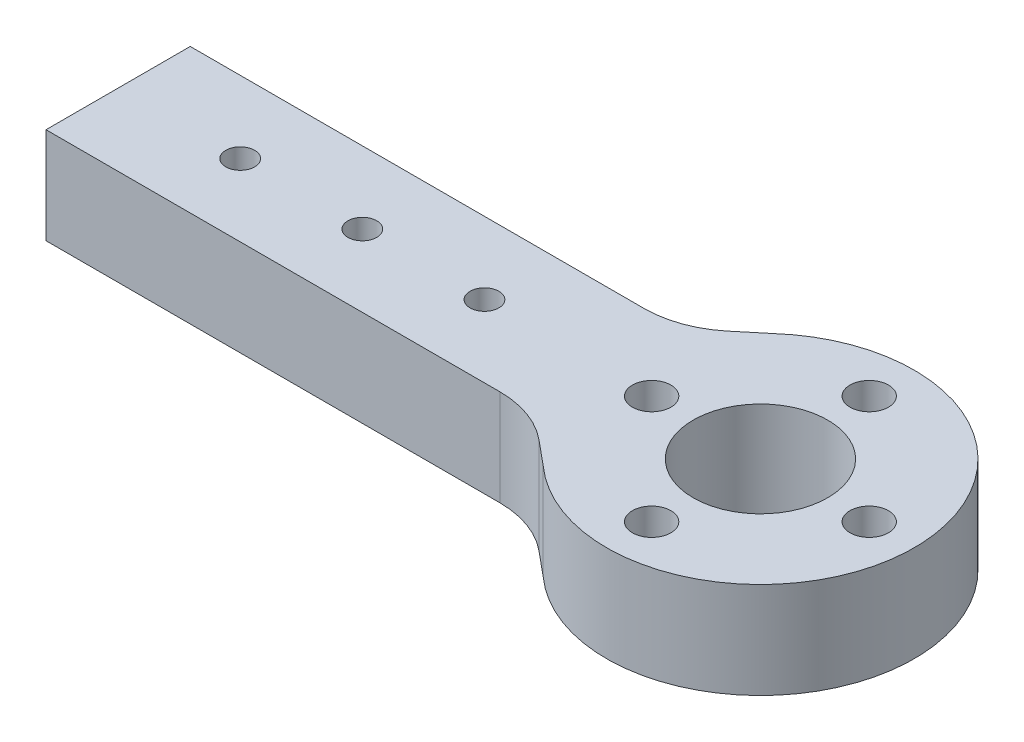
ISO-10303-21;
HEADER;
FILE_DESCRIPTION(('STEP AP214'),'2;1');
FILE_NAME('part.step','',(''),(''),'','','');
FILE_SCHEMA(('AUTOMOTIVE_DESIGN { 1 0 10303 214 1 1 1 1 }'));
ENDSEC;
DATA;
#1=APPLICATION_CONTEXT('core data for automotive mechanical design processes');
#2=APPLICATION_PROTOCOL_DEFINITION('international standard','automotive_design',2000,#1);
#3=PRODUCT_CONTEXT('',#1,'mechanical');
#4=PRODUCT('Part','Part','',(#3));
#5=PRODUCT_RELATED_PRODUCT_CATEGORY('part','',(#4));
#6=PRODUCT_DEFINITION_FORMATION('','',#4);
#7=PRODUCT_DEFINITION_CONTEXT('part definition',#1,'design');
#8=PRODUCT_DEFINITION('design','',#6,#7);
#9=PRODUCT_DEFINITION_SHAPE('','',#8);
#10=(LENGTH_UNIT() NAMED_UNIT(*) SI_UNIT(.MILLI.,.METRE.));
#11=(NAMED_UNIT(*) PLANE_ANGLE_UNIT() SI_UNIT($,.RADIAN.));
#12=(NAMED_UNIT(*) SI_UNIT($,.STERADIAN.) SOLID_ANGLE_UNIT());
#13=UNCERTAINTY_MEASURE_WITH_UNIT(LENGTH_MEASURE(1.E-05),#10,'distance_accuracy_value','');
#14=(GEOMETRIC_REPRESENTATION_CONTEXT(3) GLOBAL_UNCERTAINTY_ASSIGNED_CONTEXT((#13)) GLOBAL_UNIT_ASSIGNED_CONTEXT((#10,
#11,#12)) REPRESENTATION_CONTEXT('',''));
#15=CARTESIAN_POINT('',(0.,0.,0.));
#16=DIRECTION('',(0.,0.,1.));
#17=DIRECTION('',(1.,0.,0.));
#18=AXIS2_PLACEMENT_3D('',#15,#16,#17);
#19=CARTESIAN_POINT('',(20.7132446022363,10.,-24.9638603553524));
#20=DIRECTION('',(0.638546032386932,0.,-0.769583630623019));
#21=DIRECTION('',(-0.769583630623019,0.,-0.638546032386932));
#22=AXIS2_PLACEMENT_3D('',#19,#20,#21);
#23=PLANE('',#22);
#24=DIRECTION('',(0.769583630623019,0.,0.638546032386932));
#25=VECTOR('',#24,1.);
#26=CARTESIAN_POINT('',(20.7132446022363,0.,-24.9638603553524));
#27=LINE('',#26,#25);
#28=CARTESIAN_POINT('',(53.5770067795623,0.,2.3041636937698));
#29=VERTEX_POINT('',#28);
#30=CARTESIAN_POINT('',(56.126078820761,0.,4.41920327284473));
#31=VERTEX_POINT('',#30);
#32=EDGE_CURVE('E159',#29,#31,#27,.T.);
#33=ORIENTED_EDGE('',*,*,#32,.T.);
#34=DIRECTION('',(0.,-1.,0.));
#35=VECTOR('',#34,1.);
#36=CARTESIAN_POINT('',(56.126078820761,10.,4.41920327284473));
#37=LINE('',#36,#35);
#38=CARTESIAN_POINT('',(56.126078820761,10.,4.41920327284473));
#39=VERTEX_POINT('',#38);
#40=EDGE_CURVE('E11',#39,#31,#37,.T.);
#41=ORIENTED_EDGE('',*,*,#40,.F.);
#42=DIRECTION('',(0.769583630623019,0.,0.638546032386932));
#43=VECTOR('',#42,1.);
#44=CARTESIAN_POINT('',(20.7132446022363,10.,-24.9638603553524));
#45=LINE('',#44,#43);
#46=CARTESIAN_POINT('',(53.5770067795623,10.,2.3041636937698));
#47=VERTEX_POINT('',#46);
#48=EDGE_CURVE('E219',#47,#39,#45,.T.);
#49=ORIENTED_EDGE('',*,*,#48,.F.);
#50=DIRECTION('',(0.,-1.,0.));
#51=VECTOR('',#50,1.);
#52=CARTESIAN_POINT('',(53.5770067795623,10.,2.3041636937698));
#53=LINE('',#52,#51);
#54=EDGE_CURVE('E52',#47,#29,#53,.T.);
#55=ORIENTED_EDGE('',*,*,#54,.T.);
#56=EDGE_LOOP('',(#33,#41,#49,#55));
#57=FACE_BOUND('',#56,.T.);
#58=ADVANCED_FACE('F35',(#57),#23,.F.);
#59=CARTESIAN_POINT('',(66.8,10.,-7.5));
#60=DIRECTION('',(0.,-1.,0.));
#61=DIRECTION('',(0.,0.,-1.));
#62=AXIS2_PLACEMENT_3D('',#59,#60,#61);
#63=CYLINDRICAL_SURFACE('',#62,16.);
#64=CARTESIAN_POINT('',(66.8,0.,-7.5));
#65=DIRECTION('',(0.,1.,0.));
#66=DIRECTION('',(0.,0.,1.));
#67=AXIS2_PLACEMENT_3D('',#64,#65,#66);
#68=CIRCLE('',#67,16.);
#69=CARTESIAN_POINT('',(56.126078820761,0.,-19.4192032728447));
#70=VERTEX_POINT('',#69);
#71=EDGE_CURVE('E161',#31,#70,#68,.T.);
#72=ORIENTED_EDGE('',*,*,#71,.T.);
#73=DIRECTION('',(0.,-1.,0.));
#74=VECTOR('',#73,1.);
#75=CARTESIAN_POINT('',(56.126078820761,10.,-19.4192032728447));
#76=LINE('',#75,#74);
#77=CARTESIAN_POINT('',(56.126078820761,10.,-19.4192032728447));
#78=VERTEX_POINT('',#77);
#79=EDGE_CURVE('E44',#78,#70,#76,.T.);
#80=ORIENTED_EDGE('',*,*,#79,.F.);
#81=CARTESIAN_POINT('',(66.8,10.,-7.5));
#82=DIRECTION('',(0.,1.,0.));
#83=DIRECTION('',(0.,0.,1.));
#84=AXIS2_PLACEMENT_3D('',#81,#82,#83);
#85=CIRCLE('',#84,16.);
#86=EDGE_CURVE('E91',#39,#78,#85,.T.);
#87=ORIENTED_EDGE('',*,*,#86,.F.);
#88=ORIENTED_EDGE('',*,*,#40,.T.);
#89=EDGE_LOOP('',(#72,#80,#87,#88));
#90=FACE_BOUND('',#89,.T.);
#91=ADVANCED_FACE('F207',(#90),#63,.T.);
#92=CARTESIAN_POINT('',(13.3420259933725,10.,16.0799758875088));
#93=DIRECTION('',(-0.638546032386932,0.,-0.769583630623019));
#94=DIRECTION('',(-0.769583630623019,0.,0.638546032386932));
#95=AXIS2_PLACEMENT_3D('',#92,#93,#94);
#96=PLANE('',#95);
#97=DIRECTION('',(0.769583630623019,0.,-0.638546032386932));
#98=VECTOR('',#97,1.);
#99=CARTESIAN_POINT('',(13.3420259933725,0.,16.0799758875088));
#100=LINE('',#99,#98);
#101=CARTESIAN_POINT('',(53.5770067795623,0.,-17.3041636937698));
#102=VERTEX_POINT('',#101);
#103=EDGE_CURVE('E164',#102,#70,#100,.T.);
#104=ORIENTED_EDGE('',*,*,#103,.F.);
#105=DIRECTION('',(0.,-1.,0.));
#106=VECTOR('',#105,1.);
#107=CARTESIAN_POINT('',(53.5770067795623,10.,-17.3041636937698));
#108=LINE('',#107,#106);
#109=CARTESIAN_POINT('',(53.5770067795623,10.,-17.3041636937698));
#110=VERTEX_POINT('',#109);
#111=EDGE_CURVE('E200',#110,#102,#108,.T.);
#112=ORIENTED_EDGE('',*,*,#111,.F.);
#113=DIRECTION('',(0.769583630623019,0.,-0.638546032386932));
#114=VECTOR('',#113,1.);
#115=CARTESIAN_POINT('',(13.3420259933725,10.,16.0799758875088));
#116=LINE('',#115,#114);
#117=EDGE_CURVE('E206',#110,#78,#116,.T.);
#118=ORIENTED_EDGE('',*,*,#117,.T.);
#119=ORIENTED_EDGE('',*,*,#79,.T.);
#120=EDGE_LOOP('',(#104,#112,#118,#119));
#121=FACE_BOUND('',#120,.T.);
#122=ADVANCED_FACE('F204',(#121),#96,.T.);
#123=CARTESIAN_POINT('',(47.191546455693,10.,-25.));
#124=DIRECTION('',(0.,-1.,0.));
#125=DIRECTION('',(0.,0.,-1.));
#126=AXIS2_PLACEMENT_3D('',#123,#124,#125);
#127=CYLINDRICAL_SURFACE('',#126,10.);
#128=CARTESIAN_POINT('',(47.191546455693,0.,-25.));
#129=DIRECTION('',(0.,1.,0.));
#130=DIRECTION('',(0.,0.,1.));
#131=AXIS2_PLACEMENT_3D('',#128,#129,#130);
#132=CIRCLE('',#131,10.);
#133=CARTESIAN_POINT('',(47.191546455693,0.,-15.));
#134=VERTEX_POINT('',#133);
#135=EDGE_CURVE('E167',#102,#134,#132,.F.);
#136=ORIENTED_EDGE('',*,*,#135,.T.);
#137=DIRECTION('',(0.,-1.,0.));
#138=VECTOR('',#137,1.);
#139=CARTESIAN_POINT('',(47.191546455693,10.,-15.));
#140=LINE('',#139,#138);
#141=CARTESIAN_POINT('',(47.191546455693,10.,-15.));
#142=VERTEX_POINT('',#141);
#143=EDGE_CURVE('E198',#142,#134,#140,.T.);
#144=ORIENTED_EDGE('',*,*,#143,.F.);
#145=CARTESIAN_POINT('',(47.191546455693,10.,-25.));
#146=DIRECTION('',(0.,1.,0.));
#147=DIRECTION('',(0.,0.,1.));
#148=AXIS2_PLACEMENT_3D('',#145,#146,#147);
#149=CIRCLE('',#148,10.);
#150=EDGE_CURVE('E130',#110,#142,#149,.F.);
#151=ORIENTED_EDGE('',*,*,#150,.F.);
#152=ORIENTED_EDGE('',*,*,#111,.T.);
#153=EDGE_LOOP('',(#136,#144,#151,#152));
#154=FACE_BOUND('',#153,.T.);
#155=ADVANCED_FACE('F216',(#154),#127,.F.);
#156=CARTESIAN_POINT('',(0.,10.,-15.));
#157=DIRECTION('',(0.,0.,-1.));
#158=DIRECTION('',(-1.,0.,0.));
#159=AXIS2_PLACEMENT_3D('',#156,#157,#158);
#160=PLANE('',#159);
#161=DIRECTION('',(1.,0.,0.));
#162=VECTOR('',#161,1.);
#163=CARTESIAN_POINT('',(0.,0.,-15.));
#164=LINE('',#163,#162);
#165=CARTESIAN_POINT('',(0.,0.,-15.));
#166=VERTEX_POINT('',#165);
#167=EDGE_CURVE('E170',#166,#134,#164,.T.);
#168=ORIENTED_EDGE('',*,*,#167,.F.);
#169=DIRECTION('',(0.,-1.,0.));
#170=VECTOR('',#169,1.);
#171=CARTESIAN_POINT('',(0.,10.,-15.));
#172=LINE('',#171,#170);
#173=CARTESIAN_POINT('',(0.,10.,-15.));
#174=VERTEX_POINT('',#173);
#175=EDGE_CURVE('E116',#174,#166,#172,.T.);
#176=ORIENTED_EDGE('',*,*,#175,.F.);
#177=DIRECTION('',(1.,0.,0.));
#178=VECTOR('',#177,1.);
#179=CARTESIAN_POINT('',(0.,10.,-15.));
#180=LINE('',#179,#178);
#181=EDGE_CURVE('E128',#174,#142,#180,.T.);
#182=ORIENTED_EDGE('',*,*,#181,.T.);
#183=ORIENTED_EDGE('',*,*,#143,.T.);
#184=EDGE_LOOP('',(#168,#176,#182,#183));
#185=FACE_BOUND('',#184,.T.);
#186=ADVANCED_FACE('F301',(#185),#160,.T.);
#187=CARTESIAN_POINT('',(0.,10.,0.));
#188=DIRECTION('',(-1.,0.,0.));
#189=DIRECTION('',(0.,0.,1.));
#190=AXIS2_PLACEMENT_3D('',#187,#188,#189);
#191=PLANE('',#190);
#192=DIRECTION('',(0.,0.,-1.));
#193=VECTOR('',#192,1.);
#194=CARTESIAN_POINT('',(0.,0.,0.));
#195=LINE('',#194,#193);
#196=CARTESIAN_POINT('',(0.,0.,0.));
#197=VERTEX_POINT('',#196);
#198=EDGE_CURVE('E113',#197,#166,#195,.T.);
#199=ORIENTED_EDGE('',*,*,#198,.F.);
#200=DIRECTION('',(0.,-1.,0.));
#201=VECTOR('',#200,1.);
#202=CARTESIAN_POINT('',(0.,10.,0.));
#203=LINE('',#202,#201);
#204=CARTESIAN_POINT('',(0.,10.,0.));
#205=VERTEX_POINT('',#204);
#206=EDGE_CURVE('E107',#205,#197,#203,.T.);
#207=ORIENTED_EDGE('',*,*,#206,.F.);
#208=DIRECTION('',(0.,0.,-1.));
#209=VECTOR('',#208,1.);
#210=CARTESIAN_POINT('',(0.,10.,0.));
#211=LINE('',#210,#209);
#212=EDGE_CURVE('E111',#205,#174,#211,.T.);
#213=ORIENTED_EDGE('',*,*,#212,.T.);
#214=ORIENTED_EDGE('',*,*,#175,.T.);
#215=EDGE_LOOP('',(#199,#207,#213,#214));
#216=FACE_BOUND('',#215,.T.);
#217=ADVANCED_FACE('F109',(#216),#191,.T.);
#218=CARTESIAN_POINT('',(0.,10.,0.));
#219=DIRECTION('',(0.,0.,-1.));
#220=DIRECTION('',(-1.,0.,0.));
#221=AXIS2_PLACEMENT_3D('',#218,#219,#220);
#222=PLANE('',#221);
#223=DIRECTION('',(1.,0.,0.));
#224=VECTOR('',#223,1.);
#225=CARTESIAN_POINT('',(0.,0.,0.));
#226=LINE('',#225,#224);
#227=CARTESIAN_POINT('',(47.191546455693,0.,0.));
#228=VERTEX_POINT('',#227);
#229=EDGE_CURVE('E174',#197,#228,#226,.T.);
#230=ORIENTED_EDGE('',*,*,#229,.T.);
#231=DIRECTION('',(0.,-1.,0.));
#232=VECTOR('',#231,1.);
#233=CARTESIAN_POINT('',(47.191546455693,10.,0.));
#234=LINE('',#233,#232);
#235=CARTESIAN_POINT('',(47.191546455693,10.,0.));
#236=VERTEX_POINT('',#235);
#237=EDGE_CURVE('E79',#236,#228,#234,.T.);
#238=ORIENTED_EDGE('',*,*,#237,.F.);
#239=DIRECTION('',(1.,0.,0.));
#240=VECTOR('',#239,1.);
#241=CARTESIAN_POINT('',(0.,10.,0.));
#242=LINE('',#241,#240);
#243=EDGE_CURVE('E118',#205,#236,#242,.T.);
#244=ORIENTED_EDGE('',*,*,#243,.F.);
#245=ORIENTED_EDGE('',*,*,#206,.T.);
#246=EDGE_LOOP('',(#230,#238,#244,#245));
#247=FACE_BOUND('',#246,.T.);
#248=ADVANCED_FACE('F119',(#247),#222,.F.);
#249=CARTESIAN_POINT('',(78.1137085,10.,-7.5));
#250=DIRECTION('',(0.,-1.,0.));
#251=DIRECTION('',(0.,0.,-1.));
#252=AXIS2_PLACEMENT_3D('',#249,#250,#251);
#253=CYLINDRICAL_SURFACE('',#252,2.);
#254=CARTESIAN_POINT('',(78.1137085,10.,-7.5));
#255=DIRECTION('',(0.,1.,0.));
#256=DIRECTION('',(0.,0.,1.));
#257=AXIS2_PLACEMENT_3D('',#254,#255,#256);
#258=CIRCLE('',#257,2.);
#259=CARTESIAN_POINT('',(78.1137085,10.,-5.5));
#260=VERTEX_POINT('',#259);
#261=EDGE_CURVE('E144',#260,#260,#258,.T.);
#262=ORIENTED_EDGE('',*,*,#261,.T.);
#263=EDGE_LOOP('',(#262));
#264=FACE_BOUND('',#263,.T.);
#265=CARTESIAN_POINT('',(78.1137085,0.,-7.5));
#266=DIRECTION('',(0.,1.,0.));
#267=DIRECTION('',(0.,0.,1.));
#268=AXIS2_PLACEMENT_3D('',#265,#266,#267);
#269=CIRCLE('',#268,2.);
#270=CARTESIAN_POINT('',(78.1137085,0.,-5.5));
#271=VERTEX_POINT('',#270);
#272=EDGE_CURVE('E188',#271,#271,#269,.T.);
#273=ORIENTED_EDGE('',*,*,#272,.F.);
#274=EDGE_LOOP('',(#273));
#275=FACE_BOUND('',#274,.T.);
#276=ADVANCED_FACE('F279',(#264,#275),#253,.F.);
#277=CARTESIAN_POINT('',(25.4,10.,-7.5));
#278=DIRECTION('',(0.,-1.,0.));
#279=DIRECTION('',(0.,0.,-1.));
#280=AXIS2_PLACEMENT_3D('',#277,#278,#279);
#281=CYLINDRICAL_SURFACE('',#280,1.5);
#282=CARTESIAN_POINT('',(25.4,10.,-7.5));
#283=DIRECTION('',(0.,1.,0.));
#284=DIRECTION('',(0.,0.,1.));
#285=AXIS2_PLACEMENT_3D('',#282,#283,#284);
#286=CIRCLE('',#285,1.5);
#287=CARTESIAN_POINT('',(25.4,10.,-6.));
#288=VERTEX_POINT('',#287);
#289=EDGE_CURVE('E141',#288,#288,#286,.T.);
#290=ORIENTED_EDGE('',*,*,#289,.T.);
#291=EDGE_LOOP('',(#290));
#292=FACE_BOUND('',#291,.T.);
#293=CARTESIAN_POINT('',(25.4,0.,-7.5));
#294=DIRECTION('',(0.,1.,0.));
#295=DIRECTION('',(0.,0.,1.));
#296=AXIS2_PLACEMENT_3D('',#293,#294,#295);
#297=CIRCLE('',#296,1.5);
#298=CARTESIAN_POINT('',(25.4,0.,-6.));
#299=VERTEX_POINT('',#298);
#300=EDGE_CURVE('E185',#299,#299,#297,.T.);
#301=ORIENTED_EDGE('',*,*,#300,.F.);
#302=EDGE_LOOP('',(#301));
#303=FACE_BOUND('',#302,.T.);
#304=ADVANCED_FACE('F282',(#292,#303),#281,.F.);
#305=CARTESIAN_POINT('',(38.1,10.,-7.5));
#306=DIRECTION('',(0.,-1.,0.));
#307=DIRECTION('',(0.,0.,-1.));
#308=AXIS2_PLACEMENT_3D('',#305,#306,#307);
#309=CYLINDRICAL_SURFACE('',#308,1.5);
#310=CARTESIAN_POINT('',(38.1,10.,-7.5));
#311=DIRECTION('',(0.,1.,0.));
#312=DIRECTION('',(0.,0.,1.));
#313=AXIS2_PLACEMENT_3D('',#310,#311,#312);
#314=CIRCLE('',#313,1.5);
#315=CARTESIAN_POINT('',(38.1,10.,-6.));
#316=VERTEX_POINT('',#315);
#317=EDGE_CURVE('E138',#316,#316,#314,.T.);
#318=ORIENTED_EDGE('',*,*,#317,.T.);
#319=EDGE_LOOP('',(#318));
#320=FACE_BOUND('',#319,.T.);
#321=CARTESIAN_POINT('',(38.1,0.,-7.5));
#322=DIRECTION('',(0.,1.,0.));
#323=DIRECTION('',(0.,0.,1.));
#324=AXIS2_PLACEMENT_3D('',#321,#322,#323);
#325=CIRCLE('',#324,1.5);
#326=CARTESIAN_POINT('',(38.1,0.,-6.));
#327=VERTEX_POINT('',#326);
#328=EDGE_CURVE('E182',#327,#327,#325,.T.);
#329=ORIENTED_EDGE('',*,*,#328,.F.);
#330=EDGE_LOOP('',(#329));
#331=FACE_BOUND('',#330,.T.);
#332=ADVANCED_FACE('F286',(#320,#331),#309,.F.);
#333=CARTESIAN_POINT('',(12.7,10.,-7.5));
#334=DIRECTION('',(0.,-1.,0.));
#335=DIRECTION('',(0.,0.,-1.));
#336=AXIS2_PLACEMENT_3D('',#333,#334,#335);
#337=CYLINDRICAL_SURFACE('',#336,1.5);
#338=CARTESIAN_POINT('',(12.7,10.,-7.5));
#339=DIRECTION('',(0.,1.,0.));
#340=DIRECTION('',(0.,0.,1.));
#341=AXIS2_PLACEMENT_3D('',#338,#339,#340);
#342=CIRCLE('',#341,1.5);
#343=CARTESIAN_POINT('',(12.7,10.,-6.));
#344=VERTEX_POINT('',#343);
#345=EDGE_CURVE('E135',#344,#344,#342,.T.);
#346=ORIENTED_EDGE('',*,*,#345,.T.);
#347=EDGE_LOOP('',(#346));
#348=FACE_BOUND('',#347,.T.);
#349=CARTESIAN_POINT('',(12.7,0.,-7.5));
#350=DIRECTION('',(0.,1.,0.));
#351=DIRECTION('',(0.,0.,1.));
#352=AXIS2_PLACEMENT_3D('',#349,#350,#351);
#353=CIRCLE('',#352,1.5);
#354=CARTESIAN_POINT('',(12.7,0.,-6.));
#355=VERTEX_POINT('',#354);
#356=EDGE_CURVE('E179',#355,#355,#353,.T.);
#357=ORIENTED_EDGE('',*,*,#356,.F.);
#358=EDGE_LOOP('',(#357));
#359=FACE_BOUND('',#358,.T.);
#360=ADVANCED_FACE('F290',(#348,#359),#337,.F.);
#361=CARTESIAN_POINT('',(47.191546455693,10.,10.));
#362=DIRECTION('',(0.,-1.,0.));
#363=DIRECTION('',(0.,0.,-1.));
#364=AXIS2_PLACEMENT_3D('',#361,#362,#363);
#365=CYLINDRICAL_SURFACE('',#364,10.);
#366=CARTESIAN_POINT('',(47.191546455693,0.,10.));
#367=DIRECTION('',(0.,1.,0.));
#368=DIRECTION('',(0.,0.,1.));
#369=AXIS2_PLACEMENT_3D('',#366,#367,#368);
#370=CIRCLE('',#369,10.);
#371=EDGE_CURVE('E176',#29,#228,#370,.T.);
#372=ORIENTED_EDGE('',*,*,#371,.F.);
#373=ORIENTED_EDGE('',*,*,#54,.F.);
#374=CARTESIAN_POINT('',(47.191546455693,10.,10.));
#375=DIRECTION('',(0.,1.,0.));
#376=DIRECTION('',(0.,0.,1.));
#377=AXIS2_PLACEMENT_3D('',#374,#375,#376);
#378=CIRCLE('',#377,10.);
#379=EDGE_CURVE('E122',#47,#236,#378,.T.);
#380=ORIENTED_EDGE('',*,*,#379,.T.);
#381=ORIENTED_EDGE('',*,*,#237,.T.);
#382=EDGE_LOOP('',(#372,#373,#380,#381));
#383=FACE_BOUND('',#382,.T.);
#384=ADVANCED_FACE('F246',(#383),#365,.F.);
#385=CARTESIAN_POINT('',(66.8,10.,-18.8137085));
#386=DIRECTION('',(0.,-1.,0.));
#387=DIRECTION('',(0.,0.,-1.));
#388=AXIS2_PLACEMENT_3D('',#385,#386,#387);
#389=CYLINDRICAL_SURFACE('',#388,2.);
#390=CARTESIAN_POINT('',(66.8,10.,-18.8137085));
#391=DIRECTION('',(0.,1.,0.));
#392=DIRECTION('',(0.,0.,1.));
#393=AXIS2_PLACEMENT_3D('',#390,#391,#392);
#394=CIRCLE('',#393,2.);
#395=CARTESIAN_POINT('',(66.8,10.,-16.8137085));
#396=VERTEX_POINT('',#395);
#397=EDGE_CURVE('E223',#396,#396,#394,.T.);
#398=ORIENTED_EDGE('',*,*,#397,.T.);
#399=EDGE_LOOP('',(#398));
#400=FACE_BOUND('',#399,.T.);
#401=CARTESIAN_POINT('',(66.8,0.,-18.8137085));
#402=DIRECTION('',(0.,1.,0.));
#403=DIRECTION('',(0.,0.,1.));
#404=AXIS2_PLACEMENT_3D('',#401,#402,#403);
#405=CIRCLE('',#404,2.);
#406=CARTESIAN_POINT('',(66.8,0.,-16.8137085));
#407=VERTEX_POINT('',#406);
#408=EDGE_CURVE('E156',#407,#407,#405,.T.);
#409=ORIENTED_EDGE('',*,*,#408,.F.);
#410=EDGE_LOOP('',(#409));
#411=FACE_BOUND('',#410,.T.);
#412=ADVANCED_FACE('F242',(#400,#411),#389,.F.);
#413=CARTESIAN_POINT('',(55.4862915,10.,-7.5));
#414=DIRECTION('',(0.,-1.,0.));
#415=DIRECTION('',(0.,0.,-1.));
#416=AXIS2_PLACEMENT_3D('',#413,#414,#415);
#417=CYLINDRICAL_SURFACE('',#416,2.);
#418=CARTESIAN_POINT('',(55.4862915,10.,-7.5));
#419=DIRECTION('',(0.,1.,0.));
#420=DIRECTION('',(0.,0.,1.));
#421=AXIS2_PLACEMENT_3D('',#418,#419,#420);
#422=CIRCLE('',#421,2.);
#423=CARTESIAN_POINT('',(55.4862915,10.,-5.5));
#424=VERTEX_POINT('',#423);
#425=EDGE_CURVE('E226',#424,#424,#422,.T.);
#426=ORIENTED_EDGE('',*,*,#425,.T.);
#427=EDGE_LOOP('',(#426));
#428=FACE_BOUND('',#427,.T.);
#429=CARTESIAN_POINT('',(55.4862915,0.,-7.5));
#430=DIRECTION('',(0.,1.,0.));
#431=DIRECTION('',(0.,0.,1.));
#432=AXIS2_PLACEMENT_3D('',#429,#430,#431);
#433=CIRCLE('',#432,2.);
#434=CARTESIAN_POINT('',(55.4862915,0.,-5.5));
#435=VERTEX_POINT('',#434);
#436=EDGE_CURVE('E153',#435,#435,#433,.T.);
#437=ORIENTED_EDGE('',*,*,#436,.F.);
#438=EDGE_LOOP('',(#437));
#439=FACE_BOUND('',#438,.T.);
#440=ADVANCED_FACE('F245',(#428,#439),#417,.F.);
#441=CARTESIAN_POINT('',(66.8,10.,3.81370850000001));
#442=DIRECTION('',(0.,-1.,0.));
#443=DIRECTION('',(0.,0.,-1.));
#444=AXIS2_PLACEMENT_3D('',#441,#442,#443);
#445=CYLINDRICAL_SURFACE('',#444,2.);
#446=CARTESIAN_POINT('',(66.8,10.,3.81370850000001));
#447=DIRECTION('',(0.,1.,0.));
#448=DIRECTION('',(0.,0.,1.));
#449=AXIS2_PLACEMENT_3D('',#446,#447,#448);
#450=CIRCLE('',#449,2.);
#451=CARTESIAN_POINT('',(66.8,10.,5.8137085));
#452=VERTEX_POINT('',#451);
#453=EDGE_CURVE('E194',#452,#452,#450,.T.);
#454=ORIENTED_EDGE('',*,*,#453,.T.);
#455=EDGE_LOOP('',(#454));
#456=FACE_BOUND('',#455,.T.);
#457=CARTESIAN_POINT('',(66.8,0.,3.81370850000001));
#458=DIRECTION('',(0.,1.,0.));
#459=DIRECTION('',(0.,0.,1.));
#460=AXIS2_PLACEMENT_3D('',#457,#458,#459);
#461=CIRCLE('',#460,2.);
#462=CARTESIAN_POINT('',(66.8,0.,5.8137085));
#463=VERTEX_POINT('',#462);
#464=EDGE_CURVE('E150',#463,#463,#461,.T.);
#465=ORIENTED_EDGE('',*,*,#464,.F.);
#466=EDGE_LOOP('',(#465));
#467=FACE_BOUND('',#466,.T.);
#468=ADVANCED_FACE('F37',(#456,#467),#445,.F.);
#469=CARTESIAN_POINT('',(66.8,10.,-7.5));
#470=DIRECTION('',(0.,-1.,0.));
#471=DIRECTION('',(0.,0.,-1.));
#472=AXIS2_PLACEMENT_3D('',#469,#470,#471);
#473=CYLINDRICAL_SURFACE('',#472,7.);
#474=CARTESIAN_POINT('',(66.8,10.,-7.5));
#475=DIRECTION('',(0.,1.,0.));
#476=DIRECTION('',(0.,0.,1.));
#477=AXIS2_PLACEMENT_3D('',#474,#475,#476);
#478=CIRCLE('',#477,7.);
#479=CARTESIAN_POINT('',(66.8,10.,-0.5));
#480=VERTEX_POINT('',#479);
#481=EDGE_CURVE('E147',#480,#480,#478,.T.);
#482=ORIENTED_EDGE('',*,*,#481,.T.);
#483=EDGE_LOOP('',(#482));
#484=FACE_BOUND('',#483,.T.);
#485=CARTESIAN_POINT('',(66.8,0.,-7.5));
#486=DIRECTION('',(0.,1.,0.));
#487=DIRECTION('',(0.,0.,1.));
#488=AXIS2_PLACEMENT_3D('',#485,#486,#487);
#489=CIRCLE('',#488,7.);
#490=CARTESIAN_POINT('',(66.8,0.,-0.5));
#491=VERTEX_POINT('',#490);
#492=EDGE_CURVE('E191',#491,#491,#489,.T.);
#493=ORIENTED_EDGE('',*,*,#492,.F.);
#494=EDGE_LOOP('',(#493));
#495=FACE_BOUND('',#494,.T.);
#496=ADVANCED_FACE('F236',(#484,#495),#473,.F.);
#497=CARTESIAN_POINT('',(0.,10.,0.));
#498=DIRECTION('',(0.,1.,0.));
#499=DIRECTION('',(0.,0.,1.));
#500=AXIS2_PLACEMENT_3D('',#497,#498,#499);
#501=PLANE('',#500);
#502=ORIENTED_EDGE('',*,*,#453,.F.);
#503=EDGE_LOOP('',(#502));
#504=FACE_BOUND('',#503,.T.);
#505=ORIENTED_EDGE('',*,*,#425,.F.);
#506=EDGE_LOOP('',(#505));
#507=FACE_BOUND('',#506,.T.);
#508=ORIENTED_EDGE('',*,*,#397,.F.);
#509=EDGE_LOOP('',(#508));
#510=FACE_BOUND('',#509,.T.);
#511=ORIENTED_EDGE('',*,*,#48,.T.);
#512=ORIENTED_EDGE('',*,*,#86,.T.);
#513=ORIENTED_EDGE('',*,*,#117,.F.);
#514=ORIENTED_EDGE('',*,*,#150,.T.);
#515=ORIENTED_EDGE('',*,*,#181,.F.);
#516=ORIENTED_EDGE('',*,*,#212,.F.);
#517=ORIENTED_EDGE('',*,*,#243,.T.);
#518=ORIENTED_EDGE('',*,*,#379,.F.);
#519=EDGE_LOOP('',(#511,#512,#513,#514,#515,#516,#517,#518));
#520=FACE_BOUND('',#519,.T.);
#521=ORIENTED_EDGE('',*,*,#345,.F.);
#522=EDGE_LOOP('',(#521));
#523=FACE_BOUND('',#522,.T.);
#524=ORIENTED_EDGE('',*,*,#317,.F.);
#525=EDGE_LOOP('',(#524));
#526=FACE_BOUND('',#525,.T.);
#527=ORIENTED_EDGE('',*,*,#289,.F.);
#528=EDGE_LOOP('',(#527));
#529=FACE_BOUND('',#528,.T.);
#530=ORIENTED_EDGE('',*,*,#261,.F.);
#531=EDGE_LOOP('',(#530));
#532=FACE_BOUND('',#531,.T.);
#533=ORIENTED_EDGE('',*,*,#481,.F.);
#534=EDGE_LOOP('',(#533));
#535=FACE_BOUND('',#534,.T.);
#536=ADVANCED_FACE('F125',(#504,#507,#510,#520,#523,#526,#529,#532,#535),#501,.T.);
#537=CARTESIAN_POINT('',(0.,0.,0.));
#538=DIRECTION('',(0.,1.,0.));
#539=DIRECTION('',(0.,0.,1.));
#540=AXIS2_PLACEMENT_3D('',#537,#538,#539);
#541=PLANE('',#540);
#542=ORIENTED_EDGE('',*,*,#464,.T.);
#543=EDGE_LOOP('',(#542));
#544=FACE_BOUND('',#543,.T.);
#545=ORIENTED_EDGE('',*,*,#436,.T.);
#546=EDGE_LOOP('',(#545));
#547=FACE_BOUND('',#546,.T.);
#548=ORIENTED_EDGE('',*,*,#408,.T.);
#549=EDGE_LOOP('',(#548));
#550=FACE_BOUND('',#549,.T.);
#551=ORIENTED_EDGE('',*,*,#32,.F.);
#552=ORIENTED_EDGE('',*,*,#371,.T.);
#553=ORIENTED_EDGE('',*,*,#229,.F.);
#554=ORIENTED_EDGE('',*,*,#198,.T.);
#555=ORIENTED_EDGE('',*,*,#167,.T.);
#556=ORIENTED_EDGE('',*,*,#135,.F.);
#557=ORIENTED_EDGE('',*,*,#103,.T.);
#558=ORIENTED_EDGE('',*,*,#71,.F.);
#559=EDGE_LOOP('',(#551,#552,#553,#554,#555,#556,#557,#558));
#560=FACE_BOUND('',#559,.T.);
#561=ORIENTED_EDGE('',*,*,#356,.T.);
#562=EDGE_LOOP('',(#561));
#563=FACE_BOUND('',#562,.T.);
#564=ORIENTED_EDGE('',*,*,#328,.T.);
#565=EDGE_LOOP('',(#564));
#566=FACE_BOUND('',#565,.T.);
#567=ORIENTED_EDGE('',*,*,#300,.T.);
#568=EDGE_LOOP('',(#567));
#569=FACE_BOUND('',#568,.T.);
#570=ORIENTED_EDGE('',*,*,#272,.T.);
#571=EDGE_LOOP('',(#570));
#572=FACE_BOUND('',#571,.T.);
#573=ORIENTED_EDGE('',*,*,#492,.T.);
#574=EDGE_LOOP('',(#573));
#575=FACE_BOUND('',#574,.T.);
#576=ADVANCED_FACE('F211',(#544,#547,#550,#560,#563,#566,#569,#572,#575),#541,.F.);
#577=CLOSED_SHELL('',(#58,#91,#122,#155,#186,#217,#248,#276,#304,#332,#360,#384,#412,#440,#468,
#496,#536,#576));
#578=MANIFOLD_SOLID_BREP('B2',#577);
#579=ADVANCED_BREP_SHAPE_REPRESENTATION('',(#18,#578),#14);
#580=SHAPE_DEFINITION_REPRESENTATION(#9,#579);
ENDSEC;
END-ISO-10303-21;
